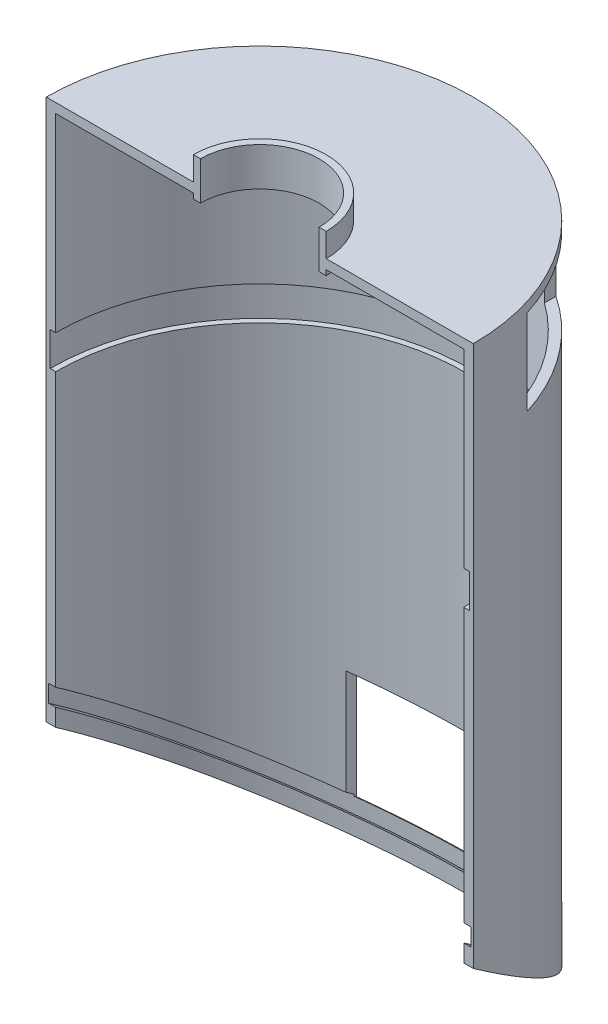
ISO-10303-21;
HEADER;
FILE_DESCRIPTION(('STEP AP214'),'2;1');
FILE_NAME('part.step','',(''),(''),'','','');
FILE_SCHEMA(('AUTOMOTIVE_DESIGN { 1 0 10303 214 1 1 1 1 }'));
ENDSEC;
DATA;
#1=APPLICATION_CONTEXT('core data for automotive mechanical design processes');
#2=APPLICATION_PROTOCOL_DEFINITION('international standard','automotive_design',2000,#1);
#3=PRODUCT_CONTEXT('',#1,'mechanical');
#4=PRODUCT('Part','Part','',(#3));
#5=PRODUCT_RELATED_PRODUCT_CATEGORY('part','',(#4));
#6=PRODUCT_DEFINITION_FORMATION('','',#4);
#7=PRODUCT_DEFINITION_CONTEXT('part definition',#1,'design');
#8=PRODUCT_DEFINITION('design','',#6,#7);
#9=PRODUCT_DEFINITION_SHAPE('','',#8);
#10=(LENGTH_UNIT() NAMED_UNIT(*) SI_UNIT(.MILLI.,.METRE.));
#11=(NAMED_UNIT(*) PLANE_ANGLE_UNIT() SI_UNIT($,.RADIAN.));
#12=(NAMED_UNIT(*) SI_UNIT($,.STERADIAN.) SOLID_ANGLE_UNIT());
#13=UNCERTAINTY_MEASURE_WITH_UNIT(LENGTH_MEASURE(1.E-05),#10,'distance_accuracy_value','');
#14=(GEOMETRIC_REPRESENTATION_CONTEXT(3) GLOBAL_UNCERTAINTY_ASSIGNED_CONTEXT((#13)) GLOBAL_UNIT_ASSIGNED_CONTEXT((#10,
#11,#12)) REPRESENTATION_CONTEXT('',''));
#15=CARTESIAN_POINT('',(0.,0.,0.));
#16=DIRECTION('',(0.,0.,1.));
#17=DIRECTION('',(1.,0.,0.));
#18=AXIS2_PLACEMENT_3D('',#15,#16,#17);
#19=CARTESIAN_POINT('',(24.834212463734,148.471380654833,0.));
#20=DIRECTION('',(0.,1.,0.));
#21=DIRECTION('',(0.,0.,1.));
#22=AXIS2_PLACEMENT_3D('',#19,#20,#21);
#23=CYLINDRICAL_SURFACE('',#22,43.);
#24=CARTESIAN_POINT('',(24.834212463734,101.074017479481,0.));
#25=DIRECTION('',(0.,0.819152044288989,-0.57357643635105));
#26=DIRECTION('',(0.,0.57357643635105,0.819152044288989));
#27=AXIS2_PLACEMENT_3D('',#24,#25,#26);
#28=ELLIPSE('',#27,52.4933073167428,43.);
#29=CARTESIAN_POINT('',(44.7798872534609,74.4001532477226,-38.0942260346953));
#30=VERTEX_POINT('',#29);
#31=CARTESIAN_POINT('',(4.88853767400717,74.4001532477226,-38.0942260346953));
#32=VERTEX_POINT('',#31);
#33=EDGE_CURVE('E238',#30,#32,#28,.T.);
#34=ORIENTED_EDGE('',*,*,#33,.F.);
#35=DIRECTION('',(0.,1.,0.));
#36=VECTOR('',#35,1.);
#37=CARTESIAN_POINT('',(44.7798872534609,148.471380654833,-38.0942260346952));
#38=LINE('',#37,#36);
#39=CARTESIAN_POINT('',(44.779887253469,52.2397464301008,-38.094226034691));
#40=VERTEX_POINT('',#39);
#41=EDGE_CURVE('E251',#30,#40,#38,.F.);
#42=ORIENTED_EDGE('',*,*,#41,.T.);
#43=CARTESIAN_POINT('',(24.834212463734,78.9136106618563,0.));
#44=DIRECTION('',(0.,-0.819152044288989,0.57357643635105));
#45=DIRECTION('',(0.,0.57357643635105,0.819152044288989));
#46=AXIS2_PLACEMENT_3D('',#43,#44,#45);
#47=ELLIPSE('',#46,52.4933073167428,43.);
#48=CARTESIAN_POINT('',(67.834212463734,78.9136106618565,3.00267395140509E-13));
#49=VERTEX_POINT('',#48);
#50=EDGE_CURVE('E282',#40,#49,#47,.T.);
#51=ORIENTED_EDGE('',*,*,#50,.T.);
#52=DIRECTION('',(0.,1.,0.));
#53=VECTOR('',#52,1.);
#54=CARTESIAN_POINT('',(67.834212463734,0.,3.00267395140509E-13));
#55=LINE('',#54,#53);
#56=CARTESIAN_POINT('',(67.834212463734,136.51795623835,3.00267395140509E-13));
#57=VERTEX_POINT('',#56);
#58=EDGE_CURVE('E390',#49,#57,#55,.T.);
#59=ORIENTED_EDGE('',*,*,#58,.T.);
#60=CARTESIAN_POINT('',(24.834212463734,136.51795623835,0.));
#61=DIRECTION('',(0.,1.,0.));
#62=DIRECTION('',(0.,0.,1.));
#63=AXIS2_PLACEMENT_3D('',#60,#61,#62);
#64=CIRCLE('',#63,43.);
#65=CARTESIAN_POINT('',(-18.1657875362659,136.51795623835,0.));
#66=VERTEX_POINT('',#65);
#67=EDGE_CURVE('E396',#57,#66,#64,.T.);
#68=ORIENTED_EDGE('',*,*,#67,.T.);
#69=DIRECTION('',(0.,1.,0.));
#70=VECTOR('',#69,1.);
#71=CARTESIAN_POINT('',(-18.1657875362659,0.,0.));
#72=LINE('',#71,#70);
#73=CARTESIAN_POINT('',(-18.1657875362659,78.9136106618563,0.));
#74=VERTEX_POINT('',#73);
#75=EDGE_CURVE('E332',#74,#66,#72,.T.);
#76=ORIENTED_EDGE('',*,*,#75,.F.);
#77=CARTESIAN_POINT('',(4.88853767399178,52.2397464301035,-38.0942260346872));
#78=VERTEX_POINT('',#77);
#79=EDGE_CURVE('E283',#74,#78,#47,.T.);
#80=ORIENTED_EDGE('',*,*,#79,.T.);
#81=DIRECTION('',(0.,1.,0.));
#82=VECTOR('',#81,1.);
#83=CARTESIAN_POINT('',(4.88853767400719,148.471380654833,-38.0942260346952));
#84=LINE('',#83,#82);
#85=EDGE_CURVE('E58',#32,#78,#84,.F.);
#86=ORIENTED_EDGE('',*,*,#85,.F.);
#87=EDGE_LOOP('',(#34,#42,#51,#59,#68,#76,#80,#86));
#88=FACE_BOUND('',#87,.T.);
#89=ADVANCED_FACE('F37',(#88),#23,.F.);
#90=CARTESIAN_POINT('',(24.834212463734,148.471380654833,0.));
#91=DIRECTION('',(0.,1.,0.));
#92=DIRECTION('',(0.,0.,1.));
#93=AXIS2_PLACEMENT_3D('',#90,#91,#92);
#94=CYLINDRICAL_SURFACE('',#93,45.);
#95=CARTESIAN_POINT('',(24.834212463734,71.5889631292875,0.));
#96=DIRECTION('',(0.,0.819152044288989,-0.57357643635105));
#97=DIRECTION('',(0.,0.57357643635105,0.819152044288989));
#98=AXIS2_PLACEMENT_3D('',#95,#96,#97);
#99=ELLIPSE('',#98,54.9348564942657,45.);
#100=CARTESIAN_POINT('',(-20.1657875362659,71.5889631292875,0.));
#101=VERTEX_POINT('',#100);
#102=CARTESIAN_POINT('',(18.7873996723502,40.3653903088837,-44.5918832868265));
#103=VERTEX_POINT('',#102);
#104=EDGE_CURVE('E262',#101,#103,#99,.F.);
#105=ORIENTED_EDGE('',*,*,#104,.F.);
#106=DIRECTION('',(0.,-1.,0.));
#107=VECTOR('',#106,1.);
#108=CARTESIAN_POINT('',(-20.1657875362659,0.,0.));
#109=LINE('',#108,#107);
#110=CARTESIAN_POINT('',(-20.165787536266,185.62795371835,0.));
#111=VERTEX_POINT('',#110);
#112=EDGE_CURVE('E351',#111,#101,#109,.T.);
#113=ORIENTED_EDGE('',*,*,#112,.F.);
#114=CARTESIAN_POINT('',(24.834212463734,185.62795371835,0.));
#115=DIRECTION('',(0.,1.,0.));
#116=DIRECTION('',(0.,0.,1.));
#117=AXIS2_PLACEMENT_3D('',#114,#115,#116);
#118=CIRCLE('',#117,45.);
#119=CARTESIAN_POINT('',(69.834212463734,185.62795371835,3.14233320495882E-13));
#120=VERTEX_POINT('',#119);
#121=EDGE_CURVE('E402',#120,#111,#118,.T.);
#122=ORIENTED_EDGE('',*,*,#121,.F.);
#123=DIRECTION('',(0.,-1.,0.));
#124=VECTOR('',#123,1.);
#125=CARTESIAN_POINT('',(69.834212463734,0.,3.14233320495882E-13));
#126=LINE('',#125,#124);
#127=CARTESIAN_POINT('',(69.834212463734,71.5889631292878,3.14233320495882E-13));
#128=VERTEX_POINT('',#127);
#129=EDGE_CURVE('E387',#120,#128,#126,.T.);
#130=ORIENTED_EDGE('',*,*,#129,.T.);
#131=CARTESIAN_POINT('',(30.8810252551178,40.3653903088837,-44.5918832868265));
#132=VERTEX_POINT('',#131);
#133=EDGE_CURVE('E260',#132,#128,#99,.F.);
#134=ORIENTED_EDGE('',*,*,#133,.F.);
#135=CARTESIAN_POINT('',(24.834212463734,40.3653903088837,0.));
#136=DIRECTION('',(0.,1.,0.));
#137=DIRECTION('',(0.,0.,1.));
#138=AXIS2_PLACEMENT_3D('',#135,#136,#137);
#139=CIRCLE('',#138,45.);
#140=EDGE_CURVE('E399',#132,#103,#139,.T.);
#141=ORIENTED_EDGE('',*,*,#140,.T.);
#142=EDGE_LOOP('',(#105,#113,#122,#130,#134,#141));
#143=FACE_BOUND('',#142,.T.);
#144=DIRECTION('',(0.,1.,0.));
#145=VECTOR('',#144,1.);
#146=CARTESIAN_POINT('',(67.834212463734,148.471380654833,-13.2664991614216));
#147=LINE('',#146,#145);
#148=CARTESIAN_POINT('',(67.834212463734,183.553951778695,-13.2664991614216));
#149=VERTEX_POINT('',#148);
#150=CARTESIAN_POINT('',(67.834212463734,165.553951778695,-13.2664991614216));
#151=VERTEX_POINT('',#150);
#152=EDGE_CURVE('E298',#149,#151,#147,.F.);
#153=ORIENTED_EDGE('',*,*,#152,.F.);
#154=CARTESIAN_POINT('',(24.834212463734,183.553951778695,0.));
#155=DIRECTION('',(0.,-1.,0.));
#156=DIRECTION('',(0.,0.,-1.));
#157=AXIS2_PLACEMENT_3D('',#154,#155,#156);
#158=CIRCLE('',#157,45.);
#159=CARTESIAN_POINT('',(49.834212463734,183.553951778695,-37.4165738677394));
#160=VERTEX_POINT('',#159);
#161=EDGE_CURVE('E312',#149,#160,#158,.F.);
#162=ORIENTED_EDGE('',*,*,#161,.T.);
#163=DIRECTION('',(0.,1.,0.));
#164=VECTOR('',#163,1.);
#165=CARTESIAN_POINT('',(49.834212463734,148.471380654833,-37.4165738677394));
#166=LINE('',#165,#164);
#167=CARTESIAN_POINT('',(49.834212463734,165.553951778695,-37.4165738677394));
#168=VERTEX_POINT('',#167);
#169=EDGE_CURVE('E422',#160,#168,#166,.F.);
#170=ORIENTED_EDGE('',*,*,#169,.T.);
#171=CARTESIAN_POINT('',(24.834212463734,165.553951778695,0.));
#172=DIRECTION('',(0.,-1.,0.));
#173=DIRECTION('',(0.,0.,-1.));
#174=AXIS2_PLACEMENT_3D('',#171,#172,#173);
#175=CIRCLE('',#174,45.);
#176=EDGE_CURVE('E307',#151,#168,#175,.F.);
#177=ORIENTED_EDGE('',*,*,#176,.F.);
#178=EDGE_LOOP('',(#153,#162,#170,#177));
#179=FACE_BOUND('',#178,.T.);
#180=CARTESIAN_POINT('',(24.834212463734,78.5473782852279,0.));
#181=DIRECTION('',(0.,0.819152044288989,-0.57357643635105));
#182=DIRECTION('',(0.,0.57357643635105,0.819152044288989));
#183=AXIS2_PLACEMENT_3D('',#180,#181,#182);
#184=ELLIPSE('',#183,54.9348564942657,45.);
#185=CARTESIAN_POINT('',(4.88853767400718,50.3022693626224,-40.3381960080326));
#186=VERTEX_POINT('',#185);
#187=CARTESIAN_POINT('',(44.7798872534609,50.3022693626224,-40.3381960080326));
#188=VERTEX_POINT('',#187);
#189=EDGE_CURVE('E228',#186,#188,#184,.F.);
#190=ORIENTED_EDGE('',*,*,#189,.T.);
#191=DIRECTION('',(0.,1.,0.));
#192=VECTOR('',#191,1.);
#193=CARTESIAN_POINT('',(44.7798872534609,148.471380654833,-40.3381960080325));
#194=LINE('',#193,#192);
#195=CARTESIAN_POINT('',(44.7798872534609,72.8289085568756,-40.3381960080326));
#196=VERTEX_POINT('',#195);
#197=EDGE_CURVE('E239',#188,#196,#194,.T.);
#198=ORIENTED_EDGE('',*,*,#197,.T.);
#199=CARTESIAN_POINT('',(24.834212463734,101.074017479481,0.));
#200=DIRECTION('',(0.,0.819152044288989,-0.57357643635105));
#201=DIRECTION('',(0.,0.57357643635105,0.819152044288989));
#202=AXIS2_PLACEMENT_3D('',#199,#200,#201);
#203=ELLIPSE('',#202,54.9348564942657,45.);
#204=CARTESIAN_POINT('',(4.88853767400717,72.8289085568756,-40.3381960080326));
#205=VERTEX_POINT('',#204);
#206=EDGE_CURVE('E11',#205,#196,#203,.F.);
#207=ORIENTED_EDGE('',*,*,#206,.F.);
#208=DIRECTION('',(0.,1.,0.));
#209=VECTOR('',#208,1.);
#210=CARTESIAN_POINT('',(4.88853767400719,148.471380654833,-40.3381960080326));
#211=LINE('',#210,#209);
#212=EDGE_CURVE('E242',#186,#205,#211,.T.);
#213=ORIENTED_EDGE('',*,*,#212,.F.);
#214=EDGE_LOOP('',(#190,#198,#207,#213));
#215=FACE_BOUND('',#214,.T.);
#216=ADVANCED_FACE('F247',(#143,#179,#215),#94,.T.);
#217=CARTESIAN_POINT('',(24.834212463734,152.74261035875,0.));
#218=DIRECTION('',(0.,-1.,0.));
#219=DIRECTION('',(1.,0.,0.));
#220=AXIS2_PLACEMENT_3D('',#217,#218,#219);
#221=CYLINDRICAL_SURFACE('',#220,44.5);
#222=CARTESIAN_POINT('',(24.8342124637341,78.9136106618563,0.));
#223=DIRECTION('',(0.,-0.819152044288989,0.57357643635105));
#224=DIRECTION('',(0.,-0.57357643635105,-0.819152044288989));
#225=AXIS2_PLACEMENT_3D('',#222,#223,#224);
#226=ELLIPSE('',#225,54.324469199885,44.5);
#227=CARTESIAN_POINT('',(69.3342124637341,78.9136106618565,3.10741839157039E-13));
#228=VERTEX_POINT('',#227);
#229=CARTESIAN_POINT('',(44.779887253469,51.059604238123,-39.7796437538363));
#230=VERTEX_POINT('',#229);
#231=EDGE_CURVE('E274',#228,#230,#226,.F.);
#232=ORIENTED_EDGE('',*,*,#231,.T.);
#233=DIRECTION('',(0.,-1.,0.));
#234=VECTOR('',#233,1.);
#235=CARTESIAN_POINT('',(44.7798872534609,152.74261035875,-39.7796437538404));
#236=LINE('',#235,#234);
#237=CARTESIAN_POINT('',(44.7798872534609,50.6933718614917,-39.7796437538404));
#238=VERTEX_POINT('',#237);
#239=EDGE_CURVE('E248',#230,#238,#236,.T.);
#240=ORIENTED_EDGE('',*,*,#239,.T.);
#241=CARTESIAN_POINT('',(24.8342124637341,78.5473782852279,0.));
#242=DIRECTION('',(0.,0.819152044288989,-0.57357643635105));
#243=DIRECTION('',(0.,-0.57357643635105,-0.819152044288989));
#244=AXIS2_PLACEMENT_3D('',#241,#242,#243);
#245=ELLIPSE('',#244,54.324469199885,44.5);
#246=CARTESIAN_POINT('',(4.8885376740072,50.6933718614918,-39.7796437538404));
#247=VERTEX_POINT('',#246);
#248=EDGE_CURVE('E45',#238,#247,#245,.T.);
#249=ORIENTED_EDGE('',*,*,#248,.T.);
#250=DIRECTION('',(0.,-1.,0.));
#251=VECTOR('',#250,1.);
#252=CARTESIAN_POINT('',(4.88853767400719,152.74261035875,-39.7796437538404));
#253=LINE('',#252,#251);
#254=CARTESIAN_POINT('',(4.88853767399178,51.0596042381256,-39.7796437538326));
#255=VERTEX_POINT('',#254);
#256=EDGE_CURVE('E245',#255,#247,#253,.T.);
#257=ORIENTED_EDGE('',*,*,#256,.F.);
#258=CARTESIAN_POINT('',(-19.6657875362659,78.9136106618563,0.));
#259=VERTEX_POINT('',#258);
#260=EDGE_CURVE('E273',#255,#259,#226,.F.);
#261=ORIENTED_EDGE('',*,*,#260,.T.);
#262=DIRECTION('',(0.,-1.,0.));
#263=VECTOR('',#262,1.);
#264=CARTESIAN_POINT('',(-19.665787536266,152.74261035875,0.));
#265=LINE('',#264,#263);
#266=CARTESIAN_POINT('',(-19.6657875362659,75.2512868955718,0.));
#267=VERTEX_POINT('',#266);
#268=EDGE_CURVE('E428',#267,#259,#265,.F.);
#269=ORIENTED_EDGE('',*,*,#268,.F.);
#270=CARTESIAN_POINT('',(24.8342124637341,75.2512868955719,0.));
#271=DIRECTION('',(0.,0.819152044288989,-0.57357643635105));
#272=DIRECTION('',(0.,-0.57357643635105,-0.819152044288989));
#273=AXIS2_PLACEMENT_3D('',#270,#271,#272);
#274=ELLIPSE('',#273,54.324469199885,44.5);
#275=CARTESIAN_POINT('',(69.3342124637341,75.2512868955721,3.10741839157039E-13));
#276=VERTEX_POINT('',#275);
#277=EDGE_CURVE('E270',#267,#276,#274,.F.);
#278=ORIENTED_EDGE('',*,*,#277,.T.);
#279=DIRECTION('',(0.,-1.,0.));
#280=VECTOR('',#279,1.);
#281=CARTESIAN_POINT('',(69.334212463734,152.74261035875,3.10741839157039E-13));
#282=LINE('',#281,#280);
#283=EDGE_CURVE('E289',#276,#228,#282,.F.);
#284=ORIENTED_EDGE('',*,*,#283,.T.);
#285=EDGE_LOOP('',(#232,#240,#249,#257,#261,#269,#278,#284));
#286=FACE_BOUND('',#285,.T.);
#287=ADVANCED_FACE('F441',(#286),#221,.F.);
#288=CARTESIAN_POINT('',(288625.132250955,42.6887560021362,-51.7344539770133));
#289=DIRECTION('',(0.,-0.819152044288989,0.57357643635105));
#290=DIRECTION('',(0.,0.57357643635105,0.819152044288989));
#291=AXIS2_PLACEMENT_3D('',#288,#289,#290);
#292=PLANE('',#291);
#293=ORIENTED_EDGE('',*,*,#50,.F.);
#294=DIRECTION('',(0.,-0.57357643635105,-0.819152044288989));
#295=VECTOR('',#294,1.);
#296=CARTESIAN_POINT('',(44.779887253469,42.6887560020367,-51.7344539769436));
#297=LINE('',#296,#295);
#298=EDGE_CURVE('E438',#40,#230,#297,.T.);
#299=ORIENTED_EDGE('',*,*,#298,.T.);
#300=ORIENTED_EDGE('',*,*,#231,.F.);
#301=DIRECTION('',(-1.,0.,0.));
#302=VECTOR('',#301,1.);
#303=CARTESIAN_POINT('',(49.6684249274677,78.9136106618564,1.73416378763983E-13));
#304=LINE('',#303,#302);
#305=EDGE_CURVE('E286',#228,#49,#304,.T.);
#306=ORIENTED_EDGE('',*,*,#305,.T.);
#307=EDGE_LOOP('',(#293,#299,#300,#306));
#308=FACE_BOUND('',#307,.T.);
#309=ADVANCED_FACE('F475',(#308),#292,.T.);
#310=CARTESIAN_POINT('',(24.834212463734,71.5889631292875,0.));
#311=DIRECTION('',(0.,0.819152044288989,-0.57357643635105));
#312=DIRECTION('',(0.,0.57357643635105,0.819152044288989));
#313=AXIS2_PLACEMENT_3D('',#310,#311,#312);
#314=ELLIPSE('',#313,52.4933073167428,43.);
#315=CARTESIAN_POINT('',(67.834212463734,71.5889631292878,3.00267395140509E-13));
#316=VERTEX_POINT('',#315);
#317=CARTESIAN_POINT('',(-18.1657875362659,71.5889631292875,0.));
#318=VERTEX_POINT('',#317);
#319=EDGE_CURVE('E268',#316,#318,#314,.T.);
#320=ORIENTED_EDGE('',*,*,#319,.F.);
#321=CARTESIAN_POINT('',(67.834212463734,75.2512868955721,3.00267395140509E-13));
#322=VERTEX_POINT('',#321);
#323=EDGE_CURVE('E368',#316,#322,#55,.T.);
#324=ORIENTED_EDGE('',*,*,#323,.T.);
#325=CARTESIAN_POINT('',(24.834212463734,75.2512868955719,0.));
#326=DIRECTION('',(0.,0.819152044288989,-0.57357643635105));
#327=DIRECTION('',(0.,0.57357643635105,0.819152044288989));
#328=AXIS2_PLACEMENT_3D('',#325,#326,#327);
#329=ELLIPSE('',#328,52.4933073167428,43.);
#330=CARTESIAN_POINT('',(-18.1657875362659,75.2512868955718,0.));
#331=VERTEX_POINT('',#330);
#332=EDGE_CURVE('E277',#322,#331,#329,.T.);
#333=ORIENTED_EDGE('',*,*,#332,.T.);
#334=EDGE_CURVE('E331',#318,#331,#72,.T.);
#335=ORIENTED_EDGE('',*,*,#334,.F.);
#336=EDGE_LOOP('',(#320,#324,#333,#335));
#337=FACE_BOUND('',#336,.T.);
#338=ADVANCED_FACE('F533',(#337),#23,.F.);
#339=CARTESIAN_POINT('',(49.6684249274681,0.,1.73416378763986E-13));
#340=DIRECTION('',(0.,0.,-1.));
#341=DIRECTION('',(-1.,0.,0.));
#342=AXIS2_PLACEMENT_3D('',#339,#340,#341);
#343=PLANE('',#342);
#344=ORIENTED_EDGE('',*,*,#323,.F.);
#345=DIRECTION('',(1.,0.,0.));
#346=VECTOR('',#345,1.);
#347=CARTESIAN_POINT('',(49.6684249274677,71.5889631292877,1.73416378763983E-13));
#348=LINE('',#347,#346);
#349=EDGE_CURVE('E265',#316,#128,#348,.T.);
#350=ORIENTED_EDGE('',*,*,#349,.T.);
#351=ORIENTED_EDGE('',*,*,#129,.F.);
#352=DIRECTION('',(1.,0.,0.));
#353=VECTOR('',#352,1.);
#354=CARTESIAN_POINT('',(49.6684249274681,185.62795371835,1.73416378763986E-13));
#355=LINE('',#354,#353);
#356=CARTESIAN_POINT('',(38.834212463734,185.62795371835,0.));
#357=VERTEX_POINT('',#356);
#358=EDGE_CURVE('E384',#357,#120,#355,.T.);
#359=ORIENTED_EDGE('',*,*,#358,.F.);
#360=DIRECTION('',(0.,-1.,0.));
#361=VECTOR('',#360,1.);
#362=CARTESIAN_POINT('',(38.834212463734,0.,0.));
#363=LINE('',#362,#361);
#364=CARTESIAN_POINT('',(38.834212463734,190.62795371835,0.));
#365=VERTEX_POINT('',#364);
#366=EDGE_CURVE('E375',#365,#357,#363,.T.);
#367=ORIENTED_EDGE('',*,*,#366,.F.);
#368=DIRECTION('',(1.,0.,0.));
#369=VECTOR('',#368,1.);
#370=CARTESIAN_POINT('',(49.6684249274681,190.62795371835,1.73416378763986E-13));
#371=LINE('',#370,#369);
#372=CARTESIAN_POINT('',(37.334212463734,190.62795371835,0.));
#373=VERTEX_POINT('',#372);
#374=EDGE_CURVE('E381',#373,#365,#371,.T.);
#375=ORIENTED_EDGE('',*,*,#374,.F.);
#376=DIRECTION('',(0.,-1.,0.));
#377=VECTOR('',#376,1.);
#378=CARTESIAN_POINT('',(37.334212463734,0.,0.));
#379=LINE('',#378,#377);
#380=CARTESIAN_POINT('',(37.334212463734,182.524240526522,0.));
#381=VERTEX_POINT('',#380);
#382=EDGE_CURVE('E378',#373,#381,#379,.T.);
#383=ORIENTED_EDGE('',*,*,#382,.T.);
#384=DIRECTION('',(-1.,0.,0.));
#385=VECTOR('',#384,1.);
#386=CARTESIAN_POINT('',(49.6684249274681,182.524240526522,1.73416378763986E-13));
#387=LINE('',#386,#385);
#388=CARTESIAN_POINT('',(38.834212463734,182.524240526522,0.));
#389=VERTEX_POINT('',#388);
#390=EDGE_CURVE('E374',#389,#381,#387,.T.);
#391=ORIENTED_EDGE('',*,*,#390,.F.);
#392=CARTESIAN_POINT('',(38.834212463734,183.62795371835,0.));
#393=VERTEX_POINT('',#392);
#394=EDGE_CURVE('E371',#393,#389,#363,.T.);
#395=ORIENTED_EDGE('',*,*,#394,.F.);
#396=DIRECTION('',(-1.,0.,0.));
#397=VECTOR('',#396,1.);
#398=CARTESIAN_POINT('',(49.6684249274681,183.62795371835,1.73416378763986E-13));
#399=LINE('',#398,#397);
#400=CARTESIAN_POINT('',(67.834212463734,183.62795371835,3.00267395140509E-13));
#401=VERTEX_POINT('',#400);
#402=EDGE_CURVE('E367',#401,#393,#399,.T.);
#403=ORIENTED_EDGE('',*,*,#402,.F.);
#404=CARTESIAN_POINT('',(67.834212463734,183.553951778695,3.60822483003176E-13));
#405=VERTEX_POINT('',#404);
#406=EDGE_CURVE('E363',#405,#401,#55,.T.);
#407=ORIENTED_EDGE('',*,*,#406,.F.);
#408=DIRECTION('',(0.,-1.,0.));
#409=VECTOR('',#408,1.);
#410=CARTESIAN_POINT('',(67.834212463734,0.,1.61676227961038E-12));
#411=LINE('',#410,#409);
#412=CARTESIAN_POINT('',(67.834212463734,165.553951778695,3.00267395140509E-13));
#413=VERTEX_POINT('',#412);
#414=EDGE_CURVE('E291',#405,#413,#411,.T.);
#415=ORIENTED_EDGE('',*,*,#414,.T.);
#416=CARTESIAN_POINT('',(67.834212463734,143.62795371835,3.00267395140509E-13));
#417=VERTEX_POINT('',#416);
#418=EDGE_CURVE('E364',#417,#413,#55,.T.);
#419=ORIENTED_EDGE('',*,*,#418,.F.);
#420=DIRECTION('',(-1.,0.,0.));
#421=VECTOR('',#420,1.);
#422=CARTESIAN_POINT('',(49.6684249274681,143.62795371835,1.73416378763986E-13));
#423=LINE('',#422,#421);
#424=CARTESIAN_POINT('',(69.0009800174271,143.62795371835,3.08414889421483E-13));
#425=VERTEX_POINT('',#424);
#426=EDGE_CURVE('E360',#425,#417,#423,.T.);
#427=ORIENTED_EDGE('',*,*,#426,.F.);
#428=DIRECTION('',(0.,1.,0.));
#429=VECTOR('',#428,1.);
#430=CARTESIAN_POINT('',(69.0009800174271,0.,3.08414889421483E-13));
#431=LINE('',#430,#429);
#432=CARTESIAN_POINT('',(69.0009800174271,136.51795623835,3.08414889421483E-13));
#433=VERTEX_POINT('',#432);
#434=EDGE_CURVE('E357',#433,#425,#431,.T.);
#435=ORIENTED_EDGE('',*,*,#434,.F.);
#436=DIRECTION('',(1.,0.,0.));
#437=VECTOR('',#436,1.);
#438=CARTESIAN_POINT('',(49.6684249274681,136.51795623835,1.73416378763986E-13));
#439=LINE('',#438,#437);
#440=EDGE_CURVE('E391',#57,#433,#439,.T.);
#441=ORIENTED_EDGE('',*,*,#440,.F.);
#442=ORIENTED_EDGE('',*,*,#58,.F.);
#443=ORIENTED_EDGE('',*,*,#305,.F.);
#444=ORIENTED_EDGE('',*,*,#283,.F.);
#445=DIRECTION('',(1.,0.,0.));
#446=VECTOR('',#445,1.);
#447=CARTESIAN_POINT('',(49.6684249274677,75.251286895572,1.73416378763983E-13));
#448=LINE('',#447,#446);
#449=EDGE_CURVE('E280',#322,#276,#448,.T.);
#450=ORIENTED_EDGE('',*,*,#449,.F.);
#451=EDGE_LOOP('',(#344,#350,#351,#359,#367,#375,#383,#391,#395,#403,#407,#415,#419,#427,#435,
#441,#442,#443,#444,#450));
#452=FACE_BOUND('',#451,.T.);
#453=ADVANCED_FACE('F471',(#452),#343,.F.);
#454=CARTESIAN_POINT('',(0.,0.,0.));
#455=DIRECTION('',(0.,0.,1.));
#456=DIRECTION('',(1.,0.,0.));
#457=AXIS2_PLACEMENT_3D('',#454,#455,#456);
#458=PLANE('',#457);
#459=DIRECTION('',(-1.,0.,0.));
#460=VECTOR('',#459,1.);
#461=CARTESIAN_POINT('',(0.,71.5889631292875,0.));
#462=LINE('',#461,#460);
#463=EDGE_CURVE('E263',#318,#101,#462,.T.);
#464=ORIENTED_EDGE('',*,*,#463,.F.);
#465=ORIENTED_EDGE('',*,*,#334,.T.);
#466=DIRECTION('',(-1.,0.,0.));
#467=VECTOR('',#466,1.);
#468=CARTESIAN_POINT('',(0.,75.2512868955719,0.));
#469=LINE('',#468,#467);
#470=EDGE_CURVE('E425',#331,#267,#469,.T.);
#471=ORIENTED_EDGE('',*,*,#470,.T.);
#472=ORIENTED_EDGE('',*,*,#268,.T.);
#473=DIRECTION('',(1.,0.,0.));
#474=VECTOR('',#473,1.);
#475=CARTESIAN_POINT('',(0.,78.9136106618563,0.));
#476=LINE('',#475,#474);
#477=EDGE_CURVE('E431',#259,#74,#476,.T.);
#478=ORIENTED_EDGE('',*,*,#477,.T.);
#479=ORIENTED_EDGE('',*,*,#75,.T.);
#480=DIRECTION('',(-1.,0.,0.));
#481=VECTOR('',#480,1.);
#482=CARTESIAN_POINT('',(0.,136.51795623835,0.));
#483=LINE('',#482,#481);
#484=CARTESIAN_POINT('',(-19.332555089959,136.51795623835,0.));
#485=VERTEX_POINT('',#484);
#486=EDGE_CURVE('E354',#66,#485,#483,.T.);
#487=ORIENTED_EDGE('',*,*,#486,.T.);
#488=DIRECTION('',(0.,1.,0.));
#489=VECTOR('',#488,1.);
#490=CARTESIAN_POINT('',(-19.332555089959,0.,0.));
#491=LINE('',#490,#489);
#492=CARTESIAN_POINT('',(-19.332555089959,143.62795371835,0.));
#493=VERTEX_POINT('',#492);
#494=EDGE_CURVE('E321',#485,#493,#491,.T.);
#495=ORIENTED_EDGE('',*,*,#494,.T.);
#496=DIRECTION('',(1.,0.,0.));
#497=VECTOR('',#496,1.);
#498=CARTESIAN_POINT('',(0.,143.62795371835,0.));
#499=LINE('',#498,#497);
#500=CARTESIAN_POINT('',(-18.1657875362659,143.62795371835,0.));
#501=VERTEX_POINT('',#500);
#502=EDGE_CURVE('E324',#493,#501,#499,.T.);
#503=ORIENTED_EDGE('',*,*,#502,.T.);
#504=CARTESIAN_POINT('',(-18.1657875362659,183.62795371835,0.));
#505=VERTEX_POINT('',#504);
#506=EDGE_CURVE('E327',#501,#505,#72,.T.);
#507=ORIENTED_EDGE('',*,*,#506,.T.);
#508=DIRECTION('',(1.,0.,0.));
#509=VECTOR('',#508,1.);
#510=CARTESIAN_POINT('',(0.,183.62795371835,0.));
#511=LINE('',#510,#509);
#512=CARTESIAN_POINT('',(10.834212463734,183.62795371835,0.));
#513=VERTEX_POINT('',#512);
#514=EDGE_CURVE('E330',#505,#513,#511,.T.);
#515=ORIENTED_EDGE('',*,*,#514,.T.);
#516=DIRECTION('',(0.,-1.,0.));
#517=VECTOR('',#516,1.);
#518=CARTESIAN_POINT('',(10.8342124637341,0.,0.));
#519=LINE('',#518,#517);
#520=CARTESIAN_POINT('',(10.8342124637341,182.524240526522,0.));
#521=VERTEX_POINT('',#520);
#522=EDGE_CURVE('E335',#513,#521,#519,.T.);
#523=ORIENTED_EDGE('',*,*,#522,.T.);
#524=DIRECTION('',(1.,0.,0.));
#525=VECTOR('',#524,1.);
#526=CARTESIAN_POINT('',(0.,182.524240526522,0.));
#527=LINE('',#526,#525);
#528=CARTESIAN_POINT('',(12.334212463734,182.524240526522,0.));
#529=VERTEX_POINT('',#528);
#530=EDGE_CURVE('E338',#521,#529,#527,.T.);
#531=ORIENTED_EDGE('',*,*,#530,.T.);
#532=DIRECTION('',(0.,-1.,0.));
#533=VECTOR('',#532,1.);
#534=CARTESIAN_POINT('',(12.3342124637341,0.,0.));
#535=LINE('',#534,#533);
#536=CARTESIAN_POINT('',(12.334212463734,190.62795371835,0.));
#537=VERTEX_POINT('',#536);
#538=EDGE_CURVE('E342',#537,#529,#535,.T.);
#539=ORIENTED_EDGE('',*,*,#538,.F.);
#540=DIRECTION('',(-1.,0.,0.));
#541=VECTOR('',#540,1.);
#542=CARTESIAN_POINT('',(0.,190.62795371835,0.));
#543=LINE('',#542,#541);
#544=CARTESIAN_POINT('',(10.834212463734,190.62795371835,0.));
#545=VERTEX_POINT('',#544);
#546=EDGE_CURVE('E345',#537,#545,#543,.T.);
#547=ORIENTED_EDGE('',*,*,#546,.T.);
#548=CARTESIAN_POINT('',(10.834212463734,185.62795371835,0.));
#549=VERTEX_POINT('',#548);
#550=EDGE_CURVE('E339',#545,#549,#519,.T.);
#551=ORIENTED_EDGE('',*,*,#550,.T.);
#552=DIRECTION('',(-1.,0.,0.));
#553=VECTOR('',#552,1.);
#554=CARTESIAN_POINT('',(0.,185.62795371835,0.));
#555=LINE('',#554,#553);
#556=EDGE_CURVE('E348',#549,#111,#555,.T.);
#557=ORIENTED_EDGE('',*,*,#556,.T.);
#558=ORIENTED_EDGE('',*,*,#112,.T.);
#559=EDGE_LOOP('',(#464,#465,#471,#472,#478,#479,#487,#495,#503,#507,#515,#523,#531,#539,#547,
#551,#557,#558));
#560=FACE_BOUND('',#559,.T.);
#561=ADVANCED_FACE('F461',(#560),#458,.T.);
#562=DIRECTION('',(0.,1.,0.));
#563=VECTOR('',#562,1.);
#564=CARTESIAN_POINT('',(49.834212463734,148.471380654833,-34.9857113690718));
#565=LINE('',#564,#563);
#566=CARTESIAN_POINT('',(49.834212463734,165.553951778695,-34.9857113690718));
#567=VERTEX_POINT('',#566);
#568=CARTESIAN_POINT('',(49.834212463734,183.553951778695,-34.9857113690718));
#569=VERTEX_POINT('',#568);
#570=EDGE_CURVE('E318',#567,#569,#565,.T.);
#571=ORIENTED_EDGE('',*,*,#570,.T.);
#572=CARTESIAN_POINT('',(24.834212463734,183.553951778695,0.));
#573=DIRECTION('',(0.,-1.,0.));
#574=DIRECTION('',(0.,0.,-1.));
#575=AXIS2_PLACEMENT_3D('',#572,#573,#574);
#576=CIRCLE('',#575,43.);
#577=EDGE_CURVE('E315',#569,#405,#576,.T.);
#578=ORIENTED_EDGE('',*,*,#577,.T.);
#579=ORIENTED_EDGE('',*,*,#406,.T.);
#580=CARTESIAN_POINT('',(24.834212463734,183.62795371835,0.));
#581=DIRECTION('',(0.,1.,0.));
#582=DIRECTION('',(0.,0.,1.));
#583=AXIS2_PLACEMENT_3D('',#580,#581,#582);
#584=CIRCLE('',#583,43.);
#585=EDGE_CURVE('E416',#401,#505,#584,.T.);
#586=ORIENTED_EDGE('',*,*,#585,.T.);
#587=ORIENTED_EDGE('',*,*,#506,.F.);
#588=CARTESIAN_POINT('',(24.834212463734,143.62795371835,0.));
#589=DIRECTION('',(0.,1.,0.));
#590=DIRECTION('',(0.,0.,1.));
#591=AXIS2_PLACEMENT_3D('',#588,#589,#590);
#592=CIRCLE('',#591,43.);
#593=EDGE_CURVE('E418',#417,#501,#592,.T.);
#594=ORIENTED_EDGE('',*,*,#593,.F.);
#595=ORIENTED_EDGE('',*,*,#418,.T.);
#596=CARTESIAN_POINT('',(24.834212463734,165.553951778695,0.));
#597=DIRECTION('',(0.,-1.,0.));
#598=DIRECTION('',(0.,0.,-1.));
#599=AXIS2_PLACEMENT_3D('',#596,#597,#598);
#600=CIRCLE('',#599,43.);
#601=EDGE_CURVE('E309',#567,#413,#600,.T.);
#602=ORIENTED_EDGE('',*,*,#601,.F.);
#603=EDGE_LOOP('',(#571,#578,#579,#586,#587,#594,#595,#602));
#604=FACE_BOUND('',#603,.T.);
#605=ADVANCED_FACE('F490',(#604),#23,.F.);
#606=CARTESIAN_POINT('',(24.834212463734,148.471380654833,0.));
#607=DIRECTION('',(0.,1.,0.));
#608=DIRECTION('',(0.,0.,1.));
#609=AXIS2_PLACEMENT_3D('',#606,#607,#608);
#610=CYLINDRICAL_SURFACE('',#609,44.166767553693);
#611=CARTESIAN_POINT('',(24.834212463734,143.62795371835,0.));
#612=DIRECTION('',(0.,1.,0.));
#613=DIRECTION('',(0.,0.,1.));
#614=AXIS2_PLACEMENT_3D('',#611,#612,#613);
#615=CIRCLE('',#614,44.166767553693);
#616=EDGE_CURVE('E420',#425,#493,#615,.T.);
#617=ORIENTED_EDGE('',*,*,#616,.T.);
#618=ORIENTED_EDGE('',*,*,#494,.F.);
#619=CARTESIAN_POINT('',(24.834212463734,136.51795623835,0.));
#620=DIRECTION('',(0.,1.,0.));
#621=DIRECTION('',(0.,0.,1.));
#622=AXIS2_PLACEMENT_3D('',#619,#620,#621);
#623=CIRCLE('',#622,44.166767553693);
#624=EDGE_CURVE('E394',#433,#485,#623,.T.);
#625=ORIENTED_EDGE('',*,*,#624,.F.);
#626=ORIENTED_EDGE('',*,*,#434,.T.);
#627=EDGE_LOOP('',(#617,#618,#625,#626));
#628=FACE_BOUND('',#627,.T.);
#629=ADVANCED_FACE('F484',(#628),#610,.F.);
#630=CARTESIAN_POINT('',(49.6684249274681,143.62795371835,1.73416378763986E-13));
#631=DIRECTION('',(0.,-1.,0.));
#632=DIRECTION('',(0.,0.,-1.));
#633=AXIS2_PLACEMENT_3D('',#630,#631,#632);
#634=PLANE('',#633);
#635=ORIENTED_EDGE('',*,*,#593,.T.);
#636=ORIENTED_EDGE('',*,*,#502,.F.);
#637=ORIENTED_EDGE('',*,*,#616,.F.);
#638=ORIENTED_EDGE('',*,*,#426,.T.);
#639=EDGE_LOOP('',(#635,#636,#637,#638));
#640=FACE_BOUND('',#639,.T.);
#641=ADVANCED_FACE('F39',(#640),#634,.T.);
#642=CARTESIAN_POINT('',(49.6684249274681,183.62795371835,1.73416378763986E-13));
#643=DIRECTION('',(0.,-1.,0.));
#644=DIRECTION('',(0.,0.,-1.));
#645=AXIS2_PLACEMENT_3D('',#642,#643,#644);
#646=PLANE('',#645);
#647=CARTESIAN_POINT('',(24.834212463734,183.62795371835,0.));
#648=DIRECTION('',(0.,1.,0.));
#649=DIRECTION('',(0.,0.,1.));
#650=AXIS2_PLACEMENT_3D('',#647,#648,#649);
#651=CIRCLE('',#650,14.);
#652=EDGE_CURVE('E414',#393,#513,#651,.T.);
#653=ORIENTED_EDGE('',*,*,#652,.T.);
#654=ORIENTED_EDGE('',*,*,#514,.F.);
#655=ORIENTED_EDGE('',*,*,#585,.F.);
#656=ORIENTED_EDGE('',*,*,#402,.T.);
#657=EDGE_LOOP('',(#653,#654,#655,#656));
#658=FACE_BOUND('',#657,.T.);
#659=ADVANCED_FACE('F496',(#658),#646,.T.);
#660=CARTESIAN_POINT('',(24.834212463734,148.471380654833,0.));
#661=DIRECTION('',(0.,1.,0.));
#662=DIRECTION('',(0.,0.,1.));
#663=AXIS2_PLACEMENT_3D('',#660,#661,#662);
#664=CYLINDRICAL_SURFACE('',#663,14.);
#665=CARTESIAN_POINT('',(24.834212463734,182.524240526522,0.));
#666=DIRECTION('',(0.,1.,0.));
#667=DIRECTION('',(0.,0.,1.));
#668=AXIS2_PLACEMENT_3D('',#665,#666,#667);
#669=CIRCLE('',#668,14.);
#670=EDGE_CURVE('E412',#389,#521,#669,.T.);
#671=ORIENTED_EDGE('',*,*,#670,.T.);
#672=ORIENTED_EDGE('',*,*,#522,.F.);
#673=ORIENTED_EDGE('',*,*,#652,.F.);
#674=ORIENTED_EDGE('',*,*,#394,.T.);
#675=EDGE_LOOP('',(#671,#672,#673,#674));
#676=FACE_BOUND('',#675,.T.);
#677=ADVANCED_FACE('F500',(#676),#664,.T.);
#678=CARTESIAN_POINT('',(49.6684249274681,182.524240526522,1.73416378763986E-13));
#679=DIRECTION('',(0.,-1.,0.));
#680=DIRECTION('',(0.,0.,-1.));
#681=AXIS2_PLACEMENT_3D('',#678,#679,#680);
#682=PLANE('',#681);
#683=CARTESIAN_POINT('',(24.834212463734,182.524240526522,0.));
#684=DIRECTION('',(0.,1.,0.));
#685=DIRECTION('',(0.,0.,1.));
#686=AXIS2_PLACEMENT_3D('',#683,#684,#685);
#687=CIRCLE('',#686,12.5);
#688=EDGE_CURVE('E410',#381,#529,#687,.T.);
#689=ORIENTED_EDGE('',*,*,#688,.T.);
#690=ORIENTED_EDGE('',*,*,#530,.F.);
#691=ORIENTED_EDGE('',*,*,#670,.F.);
#692=ORIENTED_EDGE('',*,*,#390,.T.);
#693=EDGE_LOOP('',(#689,#690,#691,#692));
#694=FACE_BOUND('',#693,.T.);
#695=ADVANCED_FACE('F505',(#694),#682,.T.);
#696=CARTESIAN_POINT('',(24.834212463734,148.471380654833,0.));
#697=DIRECTION('',(0.,1.,0.));
#698=DIRECTION('',(0.,0.,1.));
#699=AXIS2_PLACEMENT_3D('',#696,#697,#698);
#700=CYLINDRICAL_SURFACE('',#699,12.5);
#701=CARTESIAN_POINT('',(24.834212463734,190.62795371835,0.));
#702=DIRECTION('',(0.,1.,0.));
#703=DIRECTION('',(0.,0.,1.));
#704=AXIS2_PLACEMENT_3D('',#701,#702,#703);
#705=CIRCLE('',#704,12.5);
#706=EDGE_CURVE('E408',#373,#537,#705,.T.);
#707=ORIENTED_EDGE('',*,*,#706,.T.);
#708=ORIENTED_EDGE('',*,*,#538,.T.);
#709=ORIENTED_EDGE('',*,*,#688,.F.);
#710=ORIENTED_EDGE('',*,*,#382,.F.);
#711=EDGE_LOOP('',(#707,#708,#709,#710));
#712=FACE_BOUND('',#711,.T.);
#713=ADVANCED_FACE('F508',(#712),#700,.F.);
#714=CARTESIAN_POINT('',(49.6684249274681,190.62795371835,1.73416378763986E-13));
#715=DIRECTION('',(0.,1.,0.));
#716=DIRECTION('',(0.,0.,1.));
#717=AXIS2_PLACEMENT_3D('',#714,#715,#716);
#718=PLANE('',#717);
#719=CARTESIAN_POINT('',(24.834212463734,190.62795371835,0.));
#720=DIRECTION('',(0.,1.,0.));
#721=DIRECTION('',(0.,0.,1.));
#722=AXIS2_PLACEMENT_3D('',#719,#720,#721);
#723=CIRCLE('',#722,14.);
#724=EDGE_CURVE('E406',#365,#545,#723,.T.);
#725=ORIENTED_EDGE('',*,*,#724,.T.);
#726=ORIENTED_EDGE('',*,*,#546,.F.);
#727=ORIENTED_EDGE('',*,*,#706,.F.);
#728=ORIENTED_EDGE('',*,*,#374,.T.);
#729=EDGE_LOOP('',(#725,#726,#727,#728));
#730=FACE_BOUND('',#729,.T.);
#731=ADVANCED_FACE('F514',(#730),#718,.T.);
#732=CARTESIAN_POINT('',(24.834212463734,185.62795371835,0.));
#733=DIRECTION('',(0.,1.,0.));
#734=DIRECTION('',(0.,0.,1.));
#735=AXIS2_PLACEMENT_3D('',#732,#733,#734);
#736=CIRCLE('',#735,14.);
#737=EDGE_CURVE('E404',#357,#549,#736,.T.);
#738=ORIENTED_EDGE('',*,*,#737,.T.);
#739=ORIENTED_EDGE('',*,*,#550,.F.);
#740=ORIENTED_EDGE('',*,*,#724,.F.);
#741=ORIENTED_EDGE('',*,*,#366,.T.);
#742=EDGE_LOOP('',(#738,#739,#740,#741));
#743=FACE_BOUND('',#742,.T.);
#744=ADVANCED_FACE('F518',(#743),#664,.T.);
#745=CARTESIAN_POINT('',(49.6684249274681,185.62795371835,1.73416378763986E-13));
#746=DIRECTION('',(0.,1.,0.));
#747=DIRECTION('',(0.,0.,1.));
#748=AXIS2_PLACEMENT_3D('',#745,#746,#747);
#749=PLANE('',#748);
#750=ORIENTED_EDGE('',*,*,#121,.T.);
#751=ORIENTED_EDGE('',*,*,#556,.F.);
#752=ORIENTED_EDGE('',*,*,#737,.F.);
#753=ORIENTED_EDGE('',*,*,#358,.T.);
#754=EDGE_LOOP('',(#750,#751,#752,#753));
#755=FACE_BOUND('',#754,.T.);
#756=ADVANCED_FACE('F523',(#755),#749,.T.);
#757=CARTESIAN_POINT('',(49.6684249274681,40.3653903088837,1.73416378763986E-13));
#758=DIRECTION('',(0.,-1.,0.));
#759=DIRECTION('',(0.,0.,-1.));
#760=AXIS2_PLACEMENT_3D('',#757,#758,#759);
#761=PLANE('',#760);
#762=DIRECTION('',(1.,0.,0.));
#763=VECTOR('',#762,1.);
#764=CARTESIAN_POINT('',(49.6684249274681,40.3653903088837,-44.5918832868265));
#765=LINE('',#764,#763);
#766=EDGE_CURVE('E434',#103,#132,#765,.T.);
#767=ORIENTED_EDGE('',*,*,#766,.F.);
#768=ORIENTED_EDGE('',*,*,#140,.F.);
#769=EDGE_LOOP('',(#767,#768));
#770=FACE_BOUND('',#769,.T.);
#771=ADVANCED_FACE('F571',(#770),#761,.T.);
#772=CARTESIAN_POINT('',(49.6684249274681,136.51795623835,1.73416378763986E-13));
#773=DIRECTION('',(0.,1.,0.));
#774=DIRECTION('',(0.,0.,1.));
#775=AXIS2_PLACEMENT_3D('',#772,#773,#774);
#776=PLANE('',#775);
#777=ORIENTED_EDGE('',*,*,#440,.T.);
#778=ORIENTED_EDGE('',*,*,#624,.T.);
#779=ORIENTED_EDGE('',*,*,#486,.F.);
#780=ORIENTED_EDGE('',*,*,#67,.F.);
#781=EDGE_LOOP('',(#777,#778,#779,#780));
#782=FACE_BOUND('',#781,.T.);
#783=ADVANCED_FACE('F479',(#782),#776,.T.);
#784=CARTESIAN_POINT('',(0.,183.553951778695,3.60822483003176E-13));
#785=DIRECTION('',(0.,-1.,0.));
#786=DIRECTION('',(0.,0.,-1.));
#787=AXIS2_PLACEMENT_3D('',#784,#785,#786);
#788=PLANE('',#787);
#789=DIRECTION('',(0.,0.,-1.));
#790=VECTOR('',#789,1.);
#791=CARTESIAN_POINT('',(49.834212463734,183.553951778695,3.60822483003176E-13));
#792=LINE('',#791,#790);
#793=EDGE_CURVE('E295',#569,#160,#792,.T.);
#794=ORIENTED_EDGE('',*,*,#793,.T.);
#795=ORIENTED_EDGE('',*,*,#161,.F.);
#796=DIRECTION('',(0.,0.,-1.));
#797=VECTOR('',#796,1.);
#798=CARTESIAN_POINT('',(67.834212463734,183.553951778695,3.60822483003176E-13));
#799=LINE('',#798,#797);
#800=EDGE_CURVE('E294',#405,#149,#799,.T.);
#801=ORIENTED_EDGE('',*,*,#800,.F.);
#802=ORIENTED_EDGE('',*,*,#577,.F.);
#803=EDGE_LOOP('',(#794,#795,#801,#802));
#804=FACE_BOUND('',#803,.T.);
#805=ADVANCED_FACE('F568',(#804),#788,.T.);
#806=CARTESIAN_POINT('',(49.834212463734,0.,1.61676227961038E-12));
#807=DIRECTION('',(1.,0.,0.));
#808=DIRECTION('',(0.,0.,-1.));
#809=AXIS2_PLACEMENT_3D('',#806,#807,#808);
#810=PLANE('',#809);
#811=DIRECTION('',(0.,0.,-1.));
#812=VECTOR('',#811,1.);
#813=CARTESIAN_POINT('',(49.834212463734,165.553951778695,4.85722573273506E-13));
#814=LINE('',#813,#812);
#815=EDGE_CURVE('E299',#567,#168,#814,.T.);
#816=ORIENTED_EDGE('',*,*,#815,.T.);
#817=ORIENTED_EDGE('',*,*,#169,.F.);
#818=ORIENTED_EDGE('',*,*,#793,.F.);
#819=ORIENTED_EDGE('',*,*,#570,.F.);
#820=EDGE_LOOP('',(#816,#817,#818,#819));
#821=FACE_BOUND('',#820,.T.);
#822=ADVANCED_FACE('F576',(#821),#810,.T.);
#823=CARTESIAN_POINT('',(0.,165.553951778695,4.85722573273506E-13));
#824=DIRECTION('',(0.,-1.,0.));
#825=DIRECTION('',(0.,0.,-1.));
#826=AXIS2_PLACEMENT_3D('',#823,#824,#825);
#827=PLANE('',#826);
#828=ORIENTED_EDGE('',*,*,#601,.T.);
#829=DIRECTION('',(0.,0.,-1.));
#830=VECTOR('',#829,1.);
#831=CARTESIAN_POINT('',(67.834212463734,165.553951778695,4.85722573273506E-13));
#832=LINE('',#831,#830);
#833=EDGE_CURVE('E302',#413,#151,#832,.T.);
#834=ORIENTED_EDGE('',*,*,#833,.T.);
#835=ORIENTED_EDGE('',*,*,#176,.T.);
#836=ORIENTED_EDGE('',*,*,#815,.F.);
#837=EDGE_LOOP('',(#828,#834,#835,#836));
#838=FACE_BOUND('',#837,.T.);
#839=ADVANCED_FACE('F679',(#838),#827,.F.);
#840=CARTESIAN_POINT('',(67.834212463734,0.,1.61676227961038E-12));
#841=DIRECTION('',(1.,0.,0.));
#842=DIRECTION('',(0.,0.,-1.));
#843=AXIS2_PLACEMENT_3D('',#840,#841,#842);
#844=PLANE('',#843);
#845=ORIENTED_EDGE('',*,*,#152,.T.);
#846=ORIENTED_EDGE('',*,*,#833,.F.);
#847=ORIENTED_EDGE('',*,*,#414,.F.);
#848=ORIENTED_EDGE('',*,*,#800,.T.);
#849=EDGE_LOOP('',(#845,#846,#847,#848));
#850=FACE_BOUND('',#849,.T.);
#851=ADVANCED_FACE('F544',(#850),#844,.F.);
#852=DIRECTION('',(0.,-0.57357643635105,-0.819152044288989));
#853=VECTOR('',#852,1.);
#854=CARTESIAN_POINT('',(4.88853767399178,42.6887560020367,-51.7344539769436));
#855=LINE('',#854,#853);
#856=EDGE_CURVE('E436',#78,#255,#855,.T.);
#857=ORIENTED_EDGE('',*,*,#856,.F.);
#858=ORIENTED_EDGE('',*,*,#79,.F.);
#859=ORIENTED_EDGE('',*,*,#477,.F.);
#860=ORIENTED_EDGE('',*,*,#260,.F.);
#861=EDGE_LOOP('',(#857,#858,#859,#860));
#862=FACE_BOUND('',#861,.T.);
#863=ADVANCED_FACE('F458',(#862),#292,.T.);
#864=CARTESIAN_POINT('',(288625.132250955,40.2312998692692,-50.0137246679601));
#865=DIRECTION('',(0.,0.819152044288989,-0.57357643635105));
#866=DIRECTION('',(0.,-0.57357643635105,-0.819152044288989));
#867=AXIS2_PLACEMENT_3D('',#864,#865,#866);
#868=PLANE('',#867);
#869=ORIENTED_EDGE('',*,*,#449,.T.);
#870=ORIENTED_EDGE('',*,*,#277,.F.);
#871=ORIENTED_EDGE('',*,*,#470,.F.);
#872=ORIENTED_EDGE('',*,*,#332,.F.);
#873=EDGE_LOOP('',(#869,#870,#871,#872));
#874=FACE_BOUND('',#873,.T.);
#875=ADVANCED_FACE('F535',(#874),#868,.T.);
#876=CARTESIAN_POINT('',(0.,48.0369152796509,-33.6358101911531));
#877=DIRECTION('',(0.,0.819152044288989,-0.57357643635105));
#878=DIRECTION('',(0.,0.57357643635105,0.819152044288989));
#879=AXIS2_PLACEMENT_3D('',#876,#877,#878);
#880=PLANE('',#879);
#881=ORIENTED_EDGE('',*,*,#319,.T.);
#882=ORIENTED_EDGE('',*,*,#463,.T.);
#883=ORIENTED_EDGE('',*,*,#104,.T.);
#884=ORIENTED_EDGE('',*,*,#766,.T.);
#885=ORIENTED_EDGE('',*,*,#133,.T.);
#886=ORIENTED_EDGE('',*,*,#349,.F.);
#887=EDGE_LOOP('',(#881,#882,#883,#884,#885,#886));
#888=FACE_BOUND('',#887,.T.);
#889=ADVANCED_FACE('F537',(#888),#880,.F.);
#890=CARTESIAN_POINT('',(44.7798872534609,54.3264741776959,-66.7624107865346));
#891=DIRECTION('',(-1.,0.,0.));
#892=DIRECTION('',(0.,0.,1.));
#893=AXIS2_PLACEMENT_3D('',#890,#891,#892);
#894=PLANE('',#893);
#895=DIRECTION('',(0.,0.57357643635105,0.819152044288989));
#896=VECTOR('',#895,1.);
#897=CARTESIAN_POINT('',(44.7798872534609,39.2108723976373,-56.1783524755613));
#898=LINE('',#897,#896);
#899=EDGE_CURVE('E234',#188,#238,#898,.T.);
#900=ORIENTED_EDGE('',*,*,#899,.T.);
#901=ORIENTED_EDGE('',*,*,#239,.F.);
#902=ORIENTED_EDGE('',*,*,#298,.F.);
#903=ORIENTED_EDGE('',*,*,#41,.F.);
#904=DIRECTION('',(0.,0.57357643635105,0.819152044288989));
#905=VECTOR('',#904,1.);
#906=CARTESIAN_POINT('',(44.7798872534609,54.3264741776959,-66.7624107865346));
#907=LINE('',#906,#905);
#908=EDGE_CURVE('E449',#196,#30,#907,.T.);
#909=ORIENTED_EDGE('',*,*,#908,.F.);
#910=ORIENTED_EDGE('',*,*,#197,.F.);
#911=EDGE_LOOP('',(#900,#901,#902,#903,#909,#910));
#912=FACE_BOUND('',#911,.T.);
#913=ADVANCED_FACE('F444',(#912),#894,.T.);
#914=CARTESIAN_POINT('',(44.7798872534609,39.2108723976373,-56.1783524755613));
#915=DIRECTION('',(0.,0.819152044288989,-0.57357643635105));
#916=DIRECTION('',(0.,0.57357643635105,0.819152044288989));
#917=AXIS2_PLACEMENT_3D('',#914,#915,#916);
#918=PLANE('',#917);
#919=DIRECTION('',(0.,0.57357643635105,0.819152044288989));
#920=VECTOR('',#919,1.);
#921=CARTESIAN_POINT('',(4.88853767400716,39.2108723976373,-56.1783524755613));
#922=LINE('',#921,#920);
#923=EDGE_CURVE('E231',#186,#247,#922,.T.);
#924=ORIENTED_EDGE('',*,*,#923,.T.);
#925=ORIENTED_EDGE('',*,*,#248,.F.);
#926=ORIENTED_EDGE('',*,*,#899,.F.);
#927=ORIENTED_EDGE('',*,*,#189,.F.);
#928=EDGE_LOOP('',(#924,#925,#926,#927));
#929=FACE_BOUND('',#928,.T.);
#930=ADVANCED_FACE('F230',(#929),#918,.T.);
#931=CARTESIAN_POINT('',(4.88853767400717,54.3264741776959,-66.7624107865346));
#932=DIRECTION('',(-1.,0.,0.));
#933=DIRECTION('',(0.,-1.,0.));
#934=AXIS2_PLACEMENT_3D('',#931,#932,#933);
#935=PLANE('',#934);
#936=ORIENTED_EDGE('',*,*,#212,.T.);
#937=DIRECTION('',(0.,0.57357643635105,0.819152044288989));
#938=VECTOR('',#937,1.);
#939=CARTESIAN_POINT('',(4.88853767400717,54.3264741776959,-66.7624107865346));
#940=LINE('',#939,#938);
#941=EDGE_CURVE('E51',#205,#32,#940,.T.);
#942=ORIENTED_EDGE('',*,*,#941,.T.);
#943=ORIENTED_EDGE('',*,*,#85,.T.);
#944=ORIENTED_EDGE('',*,*,#856,.T.);
#945=ORIENTED_EDGE('',*,*,#256,.T.);
#946=ORIENTED_EDGE('',*,*,#923,.F.);
#947=EDGE_LOOP('',(#936,#942,#943,#944,#945,#946));
#948=FACE_BOUND('',#947,.T.);
#949=ADVANCED_FACE('F241',(#948),#935,.F.);
#950=CARTESIAN_POINT('',(44.7798872534609,54.3264741776959,-66.7624107865346));
#951=DIRECTION('',(0.,0.819152044288989,-0.57357643635105));
#952=DIRECTION('',(0.,0.57357643635105,0.819152044288989));
#953=AXIS2_PLACEMENT_3D('',#950,#951,#952);
#954=PLANE('',#953);
#955=ORIENTED_EDGE('',*,*,#33,.T.);
#956=ORIENTED_EDGE('',*,*,#941,.F.);
#957=ORIENTED_EDGE('',*,*,#206,.T.);
#958=ORIENTED_EDGE('',*,*,#908,.T.);
#959=EDGE_LOOP('',(#955,#956,#957,#958));
#960=FACE_BOUND('',#959,.T.);
#961=ADVANCED_FACE('F452',(#960),#954,.F.);
#962=CLOSED_SHELL('',(#89,#216,#287,#309,#338,#453,#561,#605,#629,#641,#659,#677,#695,#713,#731,
#744,#756,#771,#783,#805,#822,#839,#851,#863,#875,#889,#913,#930,#949,#961));
#963=MANIFOLD_SOLID_BREP('B2',#962);
#964=ADVANCED_BREP_SHAPE_REPRESENTATION('',(#18,#963),#14);
#965=SHAPE_DEFINITION_REPRESENTATION(#9,#964);
ENDSEC;
END-ISO-10303-21;
